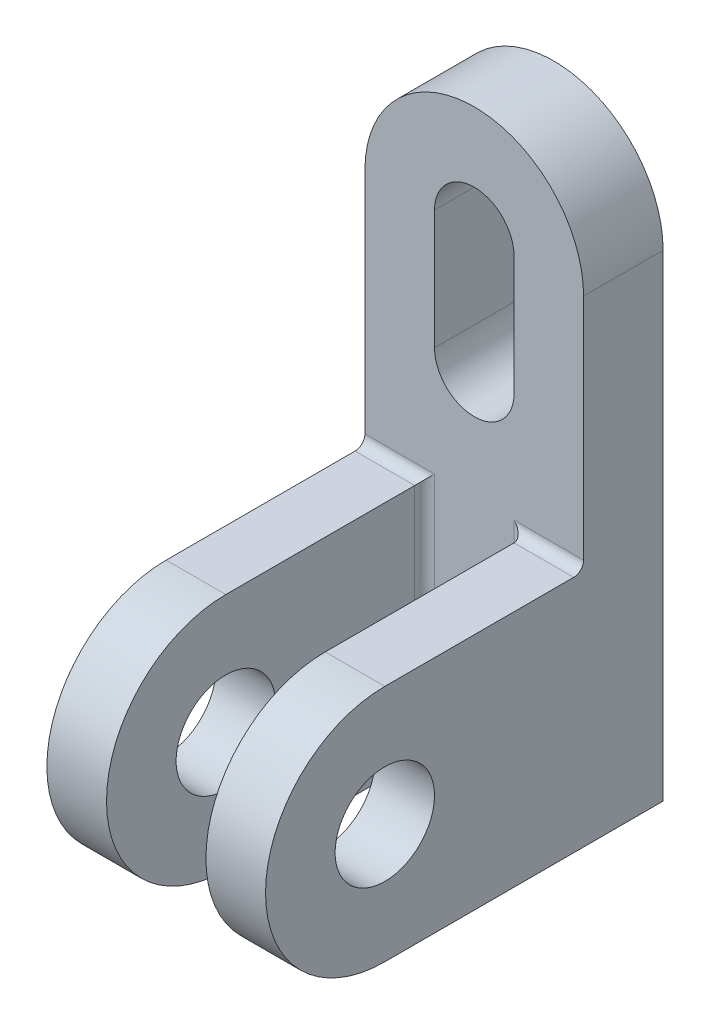
ISO-10303-21;
HEADER;
FILE_DESCRIPTION(('STEP AP214'),'2;1');
FILE_NAME('part.step','',(''),(''),'','','');
FILE_SCHEMA(('AUTOMOTIVE_DESIGN { 1 0 10303 214 1 1 1 1 }'));
ENDSEC;
DATA;
#1=APPLICATION_CONTEXT('core data for automotive mechanical design processes');
#2=APPLICATION_PROTOCOL_DEFINITION('international standard','automotive_design',2000,#1);
#3=PRODUCT_CONTEXT('',#1,'mechanical');
#4=PRODUCT('Part','Part','',(#3));
#5=PRODUCT_RELATED_PRODUCT_CATEGORY('part','',(#4));
#6=PRODUCT_DEFINITION_FORMATION('','',#4);
#7=PRODUCT_DEFINITION_CONTEXT('part definition',#1,'design');
#8=PRODUCT_DEFINITION('design','',#6,#7);
#9=PRODUCT_DEFINITION_SHAPE('','',#8);
#10=(LENGTH_UNIT() NAMED_UNIT(*) SI_UNIT(.MILLI.,.METRE.));
#11=(NAMED_UNIT(*) PLANE_ANGLE_UNIT() SI_UNIT($,.RADIAN.));
#12=(NAMED_UNIT(*) SI_UNIT($,.STERADIAN.) SOLID_ANGLE_UNIT());
#13=UNCERTAINTY_MEASURE_WITH_UNIT(LENGTH_MEASURE(1.E-05),#10,'distance_accuracy_value','');
#14=(GEOMETRIC_REPRESENTATION_CONTEXT(3) GLOBAL_UNCERTAINTY_ASSIGNED_CONTEXT((#13)) GLOBAL_UNIT_ASSIGNED_CONTEXT((#10,
#11,#12)) REPRESENTATION_CONTEXT('',''));
#15=CARTESIAN_POINT('',(0.,0.,0.));
#16=DIRECTION('',(0.,0.,1.));
#17=DIRECTION('',(1.,0.,0.));
#18=AXIS2_PLACEMENT_3D('',#15,#16,#17);
#19=CARTESIAN_POINT('',(0.,0.,16.));
#20=DIRECTION('',(0.,0.,1.));
#21=DIRECTION('',(1.,0.,0.));
#22=AXIS2_PLACEMENT_3D('',#19,#20,#21);
#23=PLANE('',#22);
#24=CARTESIAN_POINT('',(0.,37.,16.));
#25=DIRECTION('',(0.,0.,-1.));
#26=DIRECTION('',(-1.,0.,0.));
#27=AXIS2_PLACEMENT_3D('',#24,#25,#26);
#28=CIRCLE('',#27,8.);
#29=CARTESIAN_POINT('',(-8.,37.,16.));
#30=VERTEX_POINT('',#29);
#31=CARTESIAN_POINT('',(8.,37.,16.));
#32=VERTEX_POINT('',#31);
#33=EDGE_CURVE('E220',#30,#32,#28,.T.);
#34=ORIENTED_EDGE('',*,*,#33,.T.);
#35=DIRECTION('',(0.,-1.,0.));
#36=VECTOR('',#35,1.);
#37=CARTESIAN_POINT('',(8.,37.,16.));
#38=LINE('',#37,#36);
#39=CARTESIAN_POINT('',(8.,13.,16.));
#40=VERTEX_POINT('',#39);
#41=EDGE_CURVE('E223',#32,#40,#38,.T.);
#42=ORIENTED_EDGE('',*,*,#41,.T.);
#43=CARTESIAN_POINT('',(0.,13.,16.));
#44=DIRECTION('',(0.,0.,-1.));
#45=DIRECTION('',(-1.,0.,0.));
#46=AXIS2_PLACEMENT_3D('',#43,#44,#45);
#47=CIRCLE('',#46,8.);
#48=CARTESIAN_POINT('',(-8.,13.,16.));
#49=VERTEX_POINT('',#48);
#50=EDGE_CURVE('E227',#40,#49,#47,.T.);
#51=ORIENTED_EDGE('',*,*,#50,.T.);
#52=DIRECTION('',(0.,1.,0.));
#53=VECTOR('',#52,1.);
#54=CARTESIAN_POINT('',(-8.,37.,16.));
#55=LINE('',#54,#53);
#56=EDGE_CURVE('E230',#49,#30,#55,.T.);
#57=ORIENTED_EDGE('',*,*,#56,.T.);
#58=EDGE_LOOP('',(#34,#42,#51,#57));
#59=FACE_BOUND('',#58,.T.);
#60=DIRECTION('',(0.,1.,0.));
#61=VECTOR('',#60,1.);
#62=CARTESIAN_POINT('',(-22.,0.,16.));
#63=LINE('',#62,#61);
#64=CARTESIAN_POINT('',(-22.,-9.,16.));
#65=VERTEX_POINT('',#64);
#66=CARTESIAN_POINT('',(-22.,37.,16.));
#67=VERTEX_POINT('',#66);
#68=EDGE_CURVE('E258',#65,#67,#63,.T.);
#69=ORIENTED_EDGE('',*,*,#68,.F.);
#70=DIRECTION('',(-1.,0.,0.));
#71=VECTOR('',#70,1.);
#72=CARTESIAN_POINT('',(0.,-9.,16.));
#73=LINE('',#72,#71);
#74=CARTESIAN_POINT('',(-7.99999999999999,-9.,16.));
#75=VERTEX_POINT('',#74);
#76=EDGE_CURVE('E290',#65,#75,#73,.F.);
#77=ORIENTED_EDGE('',*,*,#76,.T.);
#78=DIRECTION('',(0.,-1.,0.));
#79=VECTOR('',#78,1.);
#80=CARTESIAN_POINT('',(-7.99999999999999,0.,16.));
#81=LINE('',#80,#79);
#82=CARTESIAN_POINT('',(-7.99999999999999,-59.,16.));
#83=VERTEX_POINT('',#82);
#84=EDGE_CURVE('E288',#75,#83,#81,.T.);
#85=ORIENTED_EDGE('',*,*,#84,.T.);
#86=DIRECTION('',(-1.,0.,0.));
#87=VECTOR('',#86,1.);
#88=CARTESIAN_POINT('',(0.,-59.,16.));
#89=LINE('',#88,#87);
#90=CARTESIAN_POINT('',(7.99999999999999,-59.,16.));
#91=VERTEX_POINT('',#90);
#92=EDGE_CURVE('E260',#91,#83,#89,.T.);
#93=ORIENTED_EDGE('',*,*,#92,.F.);
#94=DIRECTION('',(0.,-1.,0.));
#95=VECTOR('',#94,1.);
#96=CARTESIAN_POINT('',(7.99999999999999,0.,16.));
#97=LINE('',#96,#95);
#98=CARTESIAN_POINT('',(7.99999999999999,-9.,16.));
#99=VERTEX_POINT('',#98);
#100=EDGE_CURVE('E286',#91,#99,#97,.F.);
#101=ORIENTED_EDGE('',*,*,#100,.T.);
#102=DIRECTION('',(1.,0.,0.));
#103=VECTOR('',#102,1.);
#104=CARTESIAN_POINT('',(22.,-9.,16.));
#105=LINE('',#104,#103);
#106=CARTESIAN_POINT('',(22.,-9.,16.));
#107=VERTEX_POINT('',#106);
#108=EDGE_CURVE('E284',#99,#107,#105,.T.);
#109=ORIENTED_EDGE('',*,*,#108,.T.);
#110=DIRECTION('',(0.,1.,0.));
#111=VECTOR('',#110,1.);
#112=CARTESIAN_POINT('',(22.,0.,16.));
#113=LINE('',#112,#111);
#114=CARTESIAN_POINT('',(22.,37.,16.));
#115=VERTEX_POINT('',#114);
#116=EDGE_CURVE('E252',#107,#115,#113,.T.);
#117=ORIENTED_EDGE('',*,*,#116,.T.);
#118=CARTESIAN_POINT('',(0.,37.,16.));
#119=DIRECTION('',(0.,0.,1.));
#120=DIRECTION('',(1.,0.,0.));
#121=AXIS2_PLACEMENT_3D('',#118,#119,#120);
#122=CIRCLE('',#121,22.);
#123=EDGE_CURVE('E254',#115,#67,#122,.T.);
#124=ORIENTED_EDGE('',*,*,#123,.T.);
#125=EDGE_LOOP('',(#69,#77,#85,#93,#101,#109,#117,#124));
#126=FACE_BOUND('',#125,.T.);
#127=ADVANCED_FACE('F45',(#59,#126),#23,.T.);
#128=CARTESIAN_POINT('',(22.,0.,16.));
#129=DIRECTION('',(-1.,0.,0.));
#130=DIRECTION('',(0.,0.,1.));
#131=AXIS2_PLACEMENT_3D('',#128,#129,#130);
#132=PLANE('',#131);
#133=DIRECTION('',(0.,1.,0.));
#134=VECTOR('',#133,1.);
#135=CARTESIAN_POINT('',(22.,0.,0.));
#136=LINE('',#135,#134);
#137=CARTESIAN_POINT('',(22.,-59.,0.));
#138=VERTEX_POINT('',#137);
#139=CARTESIAN_POINT('',(22.,37.,0.));
#140=VERTEX_POINT('',#139);
#141=EDGE_CURVE('E245',#138,#140,#136,.T.);
#142=ORIENTED_EDGE('',*,*,#141,.T.);
#143=DIRECTION('',(0.,0.,-1.));
#144=VECTOR('',#143,1.);
#145=CARTESIAN_POINT('',(22.,37.,16.));
#146=LINE('',#145,#144);
#147=EDGE_CURVE('E278',#115,#140,#146,.T.);
#148=ORIENTED_EDGE('',*,*,#147,.F.);
#149=ORIENTED_EDGE('',*,*,#116,.F.);
#150=CARTESIAN_POINT('',(22.,-9.,18.));
#151=DIRECTION('',(-1.,0.,0.));
#152=DIRECTION('',(0.,0.,1.));
#153=AXIS2_PLACEMENT_3D('',#150,#151,#152);
#154=CIRCLE('',#153,2.);
#155=CARTESIAN_POINT('',(22.,-11.,18.));
#156=VERTEX_POINT('',#155);
#157=EDGE_CURVE('E11',#107,#156,#154,.T.);
#158=ORIENTED_EDGE('',*,*,#157,.T.);
#159=DIRECTION('',(0.,0.,1.));
#160=VECTOR('',#159,1.);
#161=CARTESIAN_POINT('',(22.,-11.,0.));
#162=LINE('',#161,#160);
#163=CARTESIAN_POINT('',(22.,-11.,56.));
#164=VERTEX_POINT('',#163);
#165=EDGE_CURVE('E210',#156,#164,#162,.T.);
#166=ORIENTED_EDGE('',*,*,#165,.T.);
#167=CARTESIAN_POINT('',(22.,-35.,56.));
#168=DIRECTION('',(1.,0.,0.));
#169=DIRECTION('',(0.,0.,-1.));
#170=AXIS2_PLACEMENT_3D('',#167,#168,#169);
#171=CIRCLE('',#170,24.);
#172=CARTESIAN_POINT('',(22.,-59.,56.));
#173=VERTEX_POINT('',#172);
#174=EDGE_CURVE('E200',#164,#173,#171,.T.);
#175=ORIENTED_EDGE('',*,*,#174,.T.);
#176=DIRECTION('',(0.,0.,-1.));
#177=VECTOR('',#176,1.);
#178=CARTESIAN_POINT('',(22.,-59.,16.));
#179=LINE('',#178,#177);
#180=EDGE_CURVE('E262',#173,#138,#179,.T.);
#181=ORIENTED_EDGE('',*,*,#180,.T.);
#182=EDGE_LOOP('',(#142,#148,#149,#158,#166,#175,#181));
#183=FACE_BOUND('',#182,.T.);
#184=CARTESIAN_POINT('',(22.,-35.,56.));
#185=DIRECTION('',(1.,0.,0.));
#186=DIRECTION('',(0.,0.,-1.));
#187=AXIS2_PLACEMENT_3D('',#184,#185,#186);
#188=CIRCLE('',#187,10.);
#189=CARTESIAN_POINT('',(22.,-35.,46.));
#190=VERTEX_POINT('',#189);
#191=EDGE_CURVE('E192',#190,#190,#188,.T.);
#192=ORIENTED_EDGE('',*,*,#191,.F.);
#193=EDGE_LOOP('',(#192));
#194=FACE_BOUND('',#193,.T.);
#195=ADVANCED_FACE('F322',(#183,#194),#132,.F.);
#196=CARTESIAN_POINT('',(0.,37.,16.));
#197=DIRECTION('',(0.,0.,-1.));
#198=DIRECTION('',(-1.,0.,0.));
#199=AXIS2_PLACEMENT_3D('',#196,#197,#198);
#200=CYLINDRICAL_SURFACE('',#199,22.);
#201=CARTESIAN_POINT('',(0.,37.,0.));
#202=DIRECTION('',(0.,0.,1.));
#203=DIRECTION('',(1.,0.,0.));
#204=AXIS2_PLACEMENT_3D('',#201,#202,#203);
#205=CIRCLE('',#204,22.);
#206=CARTESIAN_POINT('',(-22.,37.,0.));
#207=VERTEX_POINT('',#206);
#208=EDGE_CURVE('E265',#140,#207,#205,.T.);
#209=ORIENTED_EDGE('',*,*,#208,.T.);
#210=DIRECTION('',(0.,0.,-1.));
#211=VECTOR('',#210,1.);
#212=CARTESIAN_POINT('',(-22.,37.,16.));
#213=LINE('',#212,#211);
#214=EDGE_CURVE('E276',#67,#207,#213,.T.);
#215=ORIENTED_EDGE('',*,*,#214,.F.);
#216=ORIENTED_EDGE('',*,*,#123,.F.);
#217=ORIENTED_EDGE('',*,*,#147,.T.);
#218=EDGE_LOOP('',(#209,#215,#216,#217));
#219=FACE_BOUND('',#218,.T.);
#220=ADVANCED_FACE('F326',(#219),#200,.T.);
#221=CARTESIAN_POINT('',(-22.,0.,16.));
#222=DIRECTION('',(-1.,0.,0.));
#223=DIRECTION('',(0.,0.,1.));
#224=AXIS2_PLACEMENT_3D('',#221,#222,#223);
#225=PLANE('',#224);
#226=DIRECTION('',(0.,1.,0.));
#227=VECTOR('',#226,1.);
#228=CARTESIAN_POINT('',(-22.,0.,0.));
#229=LINE('',#228,#227);
#230=CARTESIAN_POINT('',(-22.,-59.,0.));
#231=VERTEX_POINT('',#230);
#232=EDGE_CURVE('E268',#231,#207,#229,.T.);
#233=ORIENTED_EDGE('',*,*,#232,.F.);
#234=DIRECTION('',(0.,0.,-1.));
#235=VECTOR('',#234,1.);
#236=CARTESIAN_POINT('',(-22.,-59.,16.));
#237=LINE('',#236,#235);
#238=CARTESIAN_POINT('',(-22.,-59.,56.));
#239=VERTEX_POINT('',#238);
#240=EDGE_CURVE('E274',#239,#231,#237,.T.);
#241=ORIENTED_EDGE('',*,*,#240,.F.);
#242=CARTESIAN_POINT('',(-22.,-35.,56.));
#243=DIRECTION('',(1.,0.,0.));
#244=DIRECTION('',(0.,0.,-1.));
#245=AXIS2_PLACEMENT_3D('',#242,#243,#244);
#246=CIRCLE('',#245,24.);
#247=CARTESIAN_POINT('',(-22.,-11.,56.));
#248=VERTEX_POINT('',#247);
#249=EDGE_CURVE('E189',#248,#239,#246,.T.);
#250=ORIENTED_EDGE('',*,*,#249,.F.);
#251=DIRECTION('',(0.,0.,1.));
#252=VECTOR('',#251,1.);
#253=CARTESIAN_POINT('',(-22.,-11.,0.));
#254=LINE('',#253,#252);
#255=CARTESIAN_POINT('',(-22.,-11.,18.));
#256=VERTEX_POINT('',#255);
#257=EDGE_CURVE('E309',#256,#248,#254,.T.);
#258=ORIENTED_EDGE('',*,*,#257,.F.);
#259=CARTESIAN_POINT('',(-22.,-9.,18.));
#260=DIRECTION('',(-1.,0.,0.));
#261=DIRECTION('',(0.,0.,1.));
#262=AXIS2_PLACEMENT_3D('',#259,#260,#261);
#263=CIRCLE('',#262,2.);
#264=EDGE_CURVE('E298',#256,#65,#263,.F.);
#265=ORIENTED_EDGE('',*,*,#264,.T.);
#266=ORIENTED_EDGE('',*,*,#68,.T.);
#267=ORIENTED_EDGE('',*,*,#214,.T.);
#268=EDGE_LOOP('',(#233,#241,#250,#258,#265,#266,#267));
#269=FACE_BOUND('',#268,.T.);
#270=CARTESIAN_POINT('',(-22.,-35.,56.));
#271=DIRECTION('',(1.,0.,0.));
#272=DIRECTION('',(0.,0.,-1.));
#273=AXIS2_PLACEMENT_3D('',#270,#271,#272);
#274=CIRCLE('',#273,10.);
#275=CARTESIAN_POINT('',(-22.,-35.,46.));
#276=VERTEX_POINT('',#275);
#277=EDGE_CURVE('E303',#276,#276,#274,.T.);
#278=ORIENTED_EDGE('',*,*,#277,.T.);
#279=EDGE_LOOP('',(#278));
#280=FACE_BOUND('',#279,.T.);
#281=ADVANCED_FACE('F335',(#269,#280),#225,.T.);
#282=CARTESIAN_POINT('',(0.,-59.,16.));
#283=DIRECTION('',(0.,-1.,0.));
#284=DIRECTION('',(0.,0.,-1.));
#285=AXIS2_PLACEMENT_3D('',#282,#283,#284);
#286=PLANE('',#285);
#287=DIRECTION('',(-1.,0.,0.));
#288=VECTOR('',#287,1.);
#289=CARTESIAN_POINT('',(0.,-59.,0.));
#290=LINE('',#289,#288);
#291=EDGE_CURVE('E255',#138,#231,#290,.T.);
#292=ORIENTED_EDGE('',*,*,#291,.F.);
#293=ORIENTED_EDGE('',*,*,#180,.F.);
#294=DIRECTION('',(1.,0.,0.));
#295=VECTOR('',#294,1.);
#296=CARTESIAN_POINT('',(9.99999999999999,-59.,56.));
#297=LINE('',#296,#295);
#298=CARTESIAN_POINT('',(9.99999999999999,-59.,56.));
#299=VERTEX_POINT('',#298);
#300=EDGE_CURVE('E214',#299,#173,#297,.T.);
#301=ORIENTED_EDGE('',*,*,#300,.F.);
#302=DIRECTION('',(0.,0.,1.));
#303=VECTOR('',#302,1.);
#304=CARTESIAN_POINT('',(9.99999999999999,-59.,0.));
#305=LINE('',#304,#303);
#306=CARTESIAN_POINT('',(9.99999999999999,-59.,18.));
#307=VERTEX_POINT('',#306);
#308=EDGE_CURVE('E205',#307,#299,#305,.T.);
#309=ORIENTED_EDGE('',*,*,#308,.F.);
#310=CARTESIAN_POINT('',(7.99999999999999,-59.,18.));
#311=DIRECTION('',(0.,-1.,0.));
#312=DIRECTION('',(0.,0.,-1.));
#313=AXIS2_PLACEMENT_3D('',#310,#311,#312);
#314=CIRCLE('',#313,2.);
#315=EDGE_CURVE('E54',#307,#91,#314,.F.);
#316=ORIENTED_EDGE('',*,*,#315,.T.);
#317=ORIENTED_EDGE('',*,*,#92,.T.);
#318=CARTESIAN_POINT('',(-7.99999999999999,-59.,18.));
#319=DIRECTION('',(0.,-1.,0.));
#320=DIRECTION('',(0.,0.,-1.));
#321=AXIS2_PLACEMENT_3D('',#318,#319,#320);
#322=CIRCLE('',#321,2.);
#323=CARTESIAN_POINT('',(-9.99999999999999,-59.,18.));
#324=VERTEX_POINT('',#323);
#325=EDGE_CURVE('E174',#83,#324,#322,.F.);
#326=ORIENTED_EDGE('',*,*,#325,.T.);
#327=DIRECTION('',(0.,0.,1.));
#328=VECTOR('',#327,1.);
#329=CARTESIAN_POINT('',(-9.99999999999999,-59.,0.));
#330=LINE('',#329,#328);
#331=CARTESIAN_POINT('',(-9.99999999999999,-59.,56.));
#332=VERTEX_POINT('',#331);
#333=EDGE_CURVE('E165',#324,#332,#330,.T.);
#334=ORIENTED_EDGE('',*,*,#333,.T.);
#335=DIRECTION('',(-1.,0.,0.));
#336=VECTOR('',#335,1.);
#337=CARTESIAN_POINT('',(-9.99999999999999,-59.,56.));
#338=LINE('',#337,#336);
#339=EDGE_CURVE('E170',#332,#239,#338,.T.);
#340=ORIENTED_EDGE('',*,*,#339,.T.);
#341=ORIENTED_EDGE('',*,*,#240,.T.);
#342=EDGE_LOOP('',(#292,#293,#301,#309,#316,#317,#326,#334,#340,#341));
#343=FACE_BOUND('',#342,.T.);
#344=ADVANCED_FACE('F168',(#343),#286,.T.);
#345=CARTESIAN_POINT('',(0.,0.,0.));
#346=DIRECTION('',(0.,0.,1.));
#347=DIRECTION('',(1.,0.,0.));
#348=AXIS2_PLACEMENT_3D('',#345,#346,#347);
#349=PLANE('',#348);
#350=DIRECTION('',(0.,-1.,0.));
#351=VECTOR('',#350,1.);
#352=CARTESIAN_POINT('',(8.,37.,0.));
#353=LINE('',#352,#351);
#354=CARTESIAN_POINT('',(8.,37.,0.));
#355=VERTEX_POINT('',#354);
#356=CARTESIAN_POINT('',(8.,13.,0.));
#357=VERTEX_POINT('',#356);
#358=EDGE_CURVE('E235',#355,#357,#353,.T.);
#359=ORIENTED_EDGE('',*,*,#358,.F.);
#360=CARTESIAN_POINT('',(0.,37.,0.));
#361=DIRECTION('',(0.,0.,-1.));
#362=DIRECTION('',(-1.,0.,0.));
#363=AXIS2_PLACEMENT_3D('',#360,#361,#362);
#364=CIRCLE('',#363,8.);
#365=CARTESIAN_POINT('',(-8.,37.,0.));
#366=VERTEX_POINT('',#365);
#367=EDGE_CURVE('E217',#366,#355,#364,.T.);
#368=ORIENTED_EDGE('',*,*,#367,.F.);
#369=DIRECTION('',(0.,1.,0.));
#370=VECTOR('',#369,1.);
#371=CARTESIAN_POINT('',(-8.,37.,0.));
#372=LINE('',#371,#370);
#373=CARTESIAN_POINT('',(-8.,13.,0.));
#374=VERTEX_POINT('',#373);
#375=EDGE_CURVE('E224',#374,#366,#372,.T.);
#376=ORIENTED_EDGE('',*,*,#375,.F.);
#377=CARTESIAN_POINT('',(0.,13.,0.));
#378=DIRECTION('',(0.,0.,-1.));
#379=DIRECTION('',(-1.,0.,0.));
#380=AXIS2_PLACEMENT_3D('',#377,#378,#379);
#381=CIRCLE('',#380,8.);
#382=EDGE_CURVE('E238',#357,#374,#381,.T.);
#383=ORIENTED_EDGE('',*,*,#382,.F.);
#384=EDGE_LOOP('',(#359,#368,#376,#383));
#385=FACE_BOUND('',#384,.T.);
#386=ORIENTED_EDGE('',*,*,#141,.F.);
#387=ORIENTED_EDGE('',*,*,#291,.T.);
#388=ORIENTED_EDGE('',*,*,#232,.T.);
#389=ORIENTED_EDGE('',*,*,#208,.F.);
#390=EDGE_LOOP('',(#386,#387,#388,#389));
#391=FACE_BOUND('',#390,.T.);
#392=ADVANCED_FACE('F371',(#385,#391),#349,.F.);
#393=CARTESIAN_POINT('',(0.,37.,16.));
#394=DIRECTION('',(0.,0.,-1.));
#395=DIRECTION('',(-1.,0.,0.));
#396=AXIS2_PLACEMENT_3D('',#393,#394,#395);
#397=CYLINDRICAL_SURFACE('',#396,8.);
#398=ORIENTED_EDGE('',*,*,#367,.T.);
#399=DIRECTION('',(0.,0.,-1.));
#400=VECTOR('',#399,1.);
#401=CARTESIAN_POINT('',(8.,37.,16.));
#402=LINE('',#401,#400);
#403=EDGE_CURVE('E233',#32,#355,#402,.T.);
#404=ORIENTED_EDGE('',*,*,#403,.F.);
#405=ORIENTED_EDGE('',*,*,#33,.F.);
#406=DIRECTION('',(0.,0.,-1.));
#407=VECTOR('',#406,1.);
#408=CARTESIAN_POINT('',(-8.,37.,16.));
#409=LINE('',#408,#407);
#410=EDGE_CURVE('E243',#30,#366,#409,.T.);
#411=ORIENTED_EDGE('',*,*,#410,.T.);
#412=EDGE_LOOP('',(#398,#404,#405,#411));
#413=FACE_BOUND('',#412,.T.);
#414=ADVANCED_FACE('F369',(#413),#397,.F.);
#415=CARTESIAN_POINT('',(-8.,37.,16.));
#416=DIRECTION('',(-1.,0.,0.));
#417=DIRECTION('',(0.,0.,1.));
#418=AXIS2_PLACEMENT_3D('',#415,#416,#417);
#419=PLANE('',#418);
#420=ORIENTED_EDGE('',*,*,#375,.T.);
#421=ORIENTED_EDGE('',*,*,#410,.F.);
#422=ORIENTED_EDGE('',*,*,#56,.F.);
#423=DIRECTION('',(0.,0.,-1.));
#424=VECTOR('',#423,1.);
#425=CARTESIAN_POINT('',(-8.,13.,16.));
#426=LINE('',#425,#424);
#427=EDGE_CURVE('E246',#49,#374,#426,.T.);
#428=ORIENTED_EDGE('',*,*,#427,.T.);
#429=EDGE_LOOP('',(#420,#421,#422,#428));
#430=FACE_BOUND('',#429,.T.);
#431=ADVANCED_FACE('F506',(#430),#419,.F.);
#432=CARTESIAN_POINT('',(0.,13.,16.));
#433=DIRECTION('',(0.,0.,-1.));
#434=DIRECTION('',(-1.,0.,0.));
#435=AXIS2_PLACEMENT_3D('',#432,#433,#434);
#436=CYLINDRICAL_SURFACE('',#435,8.);
#437=ORIENTED_EDGE('',*,*,#382,.T.);
#438=ORIENTED_EDGE('',*,*,#427,.F.);
#439=ORIENTED_EDGE('',*,*,#50,.F.);
#440=DIRECTION('',(0.,0.,-1.));
#441=VECTOR('',#440,1.);
#442=CARTESIAN_POINT('',(8.,13.,16.));
#443=LINE('',#442,#441);
#444=EDGE_CURVE('E248',#40,#357,#443,.T.);
#445=ORIENTED_EDGE('',*,*,#444,.T.);
#446=EDGE_LOOP('',(#437,#438,#439,#445));
#447=FACE_BOUND('',#446,.T.);
#448=ADVANCED_FACE('F497',(#447),#436,.F.);
#449=CARTESIAN_POINT('',(8.,37.,16.));
#450=DIRECTION('',(1.,0.,0.));
#451=DIRECTION('',(0.,0.,-1.));
#452=AXIS2_PLACEMENT_3D('',#449,#450,#451);
#453=PLANE('',#452);
#454=ORIENTED_EDGE('',*,*,#358,.T.);
#455=ORIENTED_EDGE('',*,*,#444,.F.);
#456=ORIENTED_EDGE('',*,*,#41,.F.);
#457=ORIENTED_EDGE('',*,*,#403,.T.);
#458=EDGE_LOOP('',(#454,#455,#456,#457));
#459=FACE_BOUND('',#458,.T.);
#460=ADVANCED_FACE('F487',(#459),#453,.F.);
#461=CARTESIAN_POINT('',(9.99999999999999,-11.,0.));
#462=DIRECTION('',(0.,1.,0.));
#463=DIRECTION('',(0.,0.,1.));
#464=AXIS2_PLACEMENT_3D('',#461,#462,#463);
#465=PLANE('',#464);
#466=ORIENTED_EDGE('',*,*,#165,.F.);
#467=DIRECTION('',(1.,0.,0.));
#468=VECTOR('',#467,1.);
#469=CARTESIAN_POINT('',(9.99999999999999,-11.,18.));
#470=LINE('',#469,#468);
#471=CARTESIAN_POINT('',(9.99999999999999,-11.,18.));
#472=VERTEX_POINT('',#471);
#473=EDGE_CURVE('E296',#156,#472,#470,.F.);
#474=ORIENTED_EDGE('',*,*,#473,.T.);
#475=DIRECTION('',(0.,0.,1.));
#476=VECTOR('',#475,1.);
#477=CARTESIAN_POINT('',(9.99999999999999,-11.,0.));
#478=LINE('',#477,#476);
#479=CARTESIAN_POINT('',(9.99999999999999,-11.,56.));
#480=VERTEX_POINT('',#479);
#481=EDGE_CURVE('E199',#472,#480,#478,.T.);
#482=ORIENTED_EDGE('',*,*,#481,.T.);
#483=DIRECTION('',(1.,0.,0.));
#484=VECTOR('',#483,1.);
#485=CARTESIAN_POINT('',(9.99999999999999,-11.,56.));
#486=LINE('',#485,#484);
#487=EDGE_CURVE('E207',#480,#164,#486,.T.);
#488=ORIENTED_EDGE('',*,*,#487,.T.);
#489=EDGE_LOOP('',(#466,#474,#482,#488));
#490=FACE_BOUND('',#489,.T.);
#491=ADVANCED_FACE('F478',(#490),#465,.T.);
#492=CARTESIAN_POINT('',(9.99999999999999,-35.,56.));
#493=DIRECTION('',(1.,0.,0.));
#494=DIRECTION('',(0.,0.,-1.));
#495=AXIS2_PLACEMENT_3D('',#492,#493,#494);
#496=CYLINDRICAL_SURFACE('',#495,10.);
#497=CARTESIAN_POINT('',(9.99999999999999,-35.,56.));
#498=DIRECTION('',(1.,0.,0.));
#499=DIRECTION('',(0.,0.,-1.));
#500=AXIS2_PLACEMENT_3D('',#497,#498,#499);
#501=CIRCLE('',#500,10.);
#502=CARTESIAN_POINT('',(9.99999999999999,-35.,46.));
#503=VERTEX_POINT('',#502);
#504=EDGE_CURVE('E196',#503,#503,#501,.T.);
#505=ORIENTED_EDGE('',*,*,#504,.F.);
#506=EDGE_LOOP('',(#505));
#507=FACE_BOUND('',#506,.T.);
#508=ORIENTED_EDGE('',*,*,#191,.T.);
#509=EDGE_LOOP('',(#508));
#510=FACE_BOUND('',#509,.T.);
#511=ADVANCED_FACE('F469',(#507,#510),#496,.F.);
#512=CARTESIAN_POINT('',(9.99999999999999,-35.,56.));
#513=DIRECTION('',(1.,0.,0.));
#514=DIRECTION('',(0.,0.,-1.));
#515=AXIS2_PLACEMENT_3D('',#512,#513,#514);
#516=CYLINDRICAL_SURFACE('',#515,24.);
#517=ORIENTED_EDGE('',*,*,#174,.F.);
#518=ORIENTED_EDGE('',*,*,#487,.F.);
#519=CARTESIAN_POINT('',(9.99999999999999,-35.,56.));
#520=DIRECTION('',(1.,0.,0.));
#521=DIRECTION('',(0.,0.,-1.));
#522=AXIS2_PLACEMENT_3D('',#519,#520,#521);
#523=CIRCLE('',#522,24.);
#524=EDGE_CURVE('E202',#480,#299,#523,.T.);
#525=ORIENTED_EDGE('',*,*,#524,.T.);
#526=ORIENTED_EDGE('',*,*,#300,.T.);
#527=EDGE_LOOP('',(#517,#518,#525,#526));
#528=FACE_BOUND('',#527,.T.);
#529=ADVANCED_FACE('F459',(#528),#516,.T.);
#530=CARTESIAN_POINT('',(9.99999999999999,0.,0.));
#531=DIRECTION('',(1.,0.,0.));
#532=DIRECTION('',(0.,0.,-1.));
#533=AXIS2_PLACEMENT_3D('',#530,#531,#532);
#534=PLANE('',#533);
#535=ORIENTED_EDGE('',*,*,#504,.T.);
#536=EDGE_LOOP('',(#535));
#537=FACE_BOUND('',#536,.T.);
#538=ORIENTED_EDGE('',*,*,#481,.F.);
#539=DIRECTION('',(0.,-1.,0.));
#540=VECTOR('',#539,1.);
#541=CARTESIAN_POINT('',(9.99999999999999,0.,18.));
#542=LINE('',#541,#540);
#543=EDGE_CURVE('E294',#472,#307,#542,.T.);
#544=ORIENTED_EDGE('',*,*,#543,.T.);
#545=ORIENTED_EDGE('',*,*,#308,.T.);
#546=ORIENTED_EDGE('',*,*,#524,.F.);
#547=EDGE_LOOP('',(#538,#544,#545,#546));
#548=FACE_BOUND('',#547,.T.);
#549=ADVANCED_FACE('F443',(#537,#548),#534,.F.);
#550=CARTESIAN_POINT('',(-9.99999999999999,-11.,0.));
#551=DIRECTION('',(0.,-1.,0.));
#552=DIRECTION('',(0.,0.,-1.));
#553=AXIS2_PLACEMENT_3D('',#550,#551,#552);
#554=PLANE('',#553);
#555=DIRECTION('',(0.,0.,1.));
#556=VECTOR('',#555,1.);
#557=CARTESIAN_POINT('',(-9.99999999999999,-11.,0.));
#558=LINE('',#557,#556);
#559=CARTESIAN_POINT('',(-9.99999999999999,-11.,18.));
#560=VERTEX_POINT('',#559);
#561=CARTESIAN_POINT('',(-9.99999999999999,-11.,56.));
#562=VERTEX_POINT('',#561);
#563=EDGE_CURVE('E178',#560,#562,#558,.T.);
#564=ORIENTED_EDGE('',*,*,#563,.F.);
#565=DIRECTION('',(-1.,0.,0.));
#566=VECTOR('',#565,1.);
#567=CARTESIAN_POINT('',(-9.99999999999999,-11.,18.));
#568=LINE('',#567,#566);
#569=EDGE_CURVE('E281',#560,#256,#568,.T.);
#570=ORIENTED_EDGE('',*,*,#569,.T.);
#571=ORIENTED_EDGE('',*,*,#257,.T.);
#572=DIRECTION('',(-1.,0.,0.));
#573=VECTOR('',#572,1.);
#574=CARTESIAN_POINT('',(-9.99999999999999,-11.,56.));
#575=LINE('',#574,#573);
#576=EDGE_CURVE('E190',#562,#248,#575,.T.);
#577=ORIENTED_EDGE('',*,*,#576,.F.);
#578=EDGE_LOOP('',(#564,#570,#571,#577));
#579=FACE_BOUND('',#578,.T.);
#580=ADVANCED_FACE('F333',(#579),#554,.F.);
#581=CARTESIAN_POINT('',(-9.99999999999999,-35.,56.));
#582=DIRECTION('',(-1.,0.,0.));
#583=DIRECTION('',(0.,0.,1.));
#584=AXIS2_PLACEMENT_3D('',#581,#582,#583);
#585=CYLINDRICAL_SURFACE('',#584,24.);
#586=ORIENTED_EDGE('',*,*,#249,.T.);
#587=ORIENTED_EDGE('',*,*,#339,.F.);
#588=CARTESIAN_POINT('',(-9.99999999999999,-35.,56.));
#589=DIRECTION('',(1.,0.,0.));
#590=DIRECTION('',(0.,0.,-1.));
#591=AXIS2_PLACEMENT_3D('',#588,#589,#590);
#592=CIRCLE('',#591,24.);
#593=EDGE_CURVE('E177',#562,#332,#592,.T.);
#594=ORIENTED_EDGE('',*,*,#593,.F.);
#595=ORIENTED_EDGE('',*,*,#576,.T.);
#596=EDGE_LOOP('',(#586,#587,#594,#595));
#597=FACE_BOUND('',#596,.T.);
#598=ADVANCED_FACE('F187',(#597),#585,.T.);
#599=CARTESIAN_POINT('',(-9.99999999999999,-35.,56.));
#600=DIRECTION('',(-1.,0.,0.));
#601=DIRECTION('',(0.,0.,1.));
#602=AXIS2_PLACEMENT_3D('',#599,#600,#601);
#603=CYLINDRICAL_SURFACE('',#602,10.);
#604=CARTESIAN_POINT('',(-9.99999999999999,-35.,56.));
#605=DIRECTION('',(1.,0.,0.));
#606=DIRECTION('',(0.,0.,-1.));
#607=AXIS2_PLACEMENT_3D('',#604,#605,#606);
#608=CIRCLE('',#607,10.);
#609=CARTESIAN_POINT('',(-9.99999999999999,-35.,46.));
#610=VERTEX_POINT('',#609);
#611=EDGE_CURVE('E338',#610,#610,#608,.T.);
#612=ORIENTED_EDGE('',*,*,#611,.T.);
#613=EDGE_LOOP('',(#612));
#614=FACE_BOUND('',#613,.T.);
#615=ORIENTED_EDGE('',*,*,#277,.F.);
#616=EDGE_LOOP('',(#615));
#617=FACE_BOUND('',#616,.T.);
#618=ADVANCED_FACE('F344',(#614,#617),#603,.F.);
#619=CARTESIAN_POINT('',(-9.99999999999999,0.,0.));
#620=DIRECTION('',(-1.,0.,0.));
#621=DIRECTION('',(0.,0.,-1.));
#622=AXIS2_PLACEMENT_3D('',#619,#620,#621);
#623=PLANE('',#622);
#624=ORIENTED_EDGE('',*,*,#611,.F.);
#625=EDGE_LOOP('',(#624));
#626=FACE_BOUND('',#625,.T.);
#627=ORIENTED_EDGE('',*,*,#333,.F.);
#628=DIRECTION('',(0.,-1.,0.));
#629=VECTOR('',#628,1.);
#630=CARTESIAN_POINT('',(-9.99999999999999,0.,18.));
#631=LINE('',#630,#629);
#632=EDGE_CURVE('E292',#324,#560,#631,.F.);
#633=ORIENTED_EDGE('',*,*,#632,.T.);
#634=ORIENTED_EDGE('',*,*,#563,.T.);
#635=ORIENTED_EDGE('',*,*,#593,.T.);
#636=EDGE_LOOP('',(#627,#633,#634,#635));
#637=FACE_BOUND('',#636,.T.);
#638=ADVANCED_FACE('F181',(#626,#637),#623,.F.);
#639=CARTESIAN_POINT('',(-7.99999999999999,0.,18.));
#640=DIRECTION('',(0.,-1.,0.));
#641=DIRECTION('',(0.,0.,-1.));
#642=AXIS2_PLACEMENT_3D('',#639,#640,#641);
#643=CYLINDRICAL_SURFACE('',#642,2.);
#644=ORIENTED_EDGE('',*,*,#325,.F.);
#645=ORIENTED_EDGE('',*,*,#84,.F.);
#646=CARTESIAN_POINT('',(-7.99999999999999,-9.,18.));
#647=DIRECTION('',(0.707106781186547,-0.707106781186547,0.));
#648=DIRECTION('',(-0.707106781186547,-0.707106781186547,0.));
#649=AXIS2_PLACEMENT_3D('',#646,#647,#648);
#650=ELLIPSE('',#649,2.82842712474619,2.);
#651=EDGE_CURVE('E301',#560,#75,#650,.T.);
#652=ORIENTED_EDGE('',*,*,#651,.F.);
#653=ORIENTED_EDGE('',*,*,#632,.F.);
#654=EDGE_LOOP('',(#644,#645,#652,#653));
#655=FACE_BOUND('',#654,.T.);
#656=ADVANCED_FACE('F348',(#655),#643,.F.);
#657=CARTESIAN_POINT('',(-9.99999999999999,-9.,18.));
#658=DIRECTION('',(-1.,0.,0.));
#659=DIRECTION('',(0.,0.,1.));
#660=AXIS2_PLACEMENT_3D('',#657,#658,#659);
#661=CYLINDRICAL_SURFACE('',#660,2.);
#662=ORIENTED_EDGE('',*,*,#651,.T.);
#663=ORIENTED_EDGE('',*,*,#76,.F.);
#664=ORIENTED_EDGE('',*,*,#264,.F.);
#665=ORIENTED_EDGE('',*,*,#569,.F.);
#666=EDGE_LOOP('',(#662,#663,#664,#665));
#667=FACE_BOUND('',#666,.T.);
#668=ADVANCED_FACE('F330',(#667),#661,.F.);
#669=CARTESIAN_POINT('',(0.,-9.,18.));
#670=DIRECTION('',(-1.,0.,0.));
#671=DIRECTION('',(0.,0.,1.));
#672=AXIS2_PLACEMENT_3D('',#669,#670,#671);
#673=CYLINDRICAL_SURFACE('',#672,2.);
#674=ORIENTED_EDGE('',*,*,#157,.F.);
#675=ORIENTED_EDGE('',*,*,#108,.F.);
#676=CARTESIAN_POINT('',(7.99999999999999,-9.,18.));
#677=DIRECTION('',(-0.707106781186547,-0.707106781186547,0.));
#678=DIRECTION('',(-0.707106781186547,0.707106781186547,0.));
#679=AXIS2_PLACEMENT_3D('',#676,#677,#678);
#680=ELLIPSE('',#679,2.82842712474619,2.);
#681=EDGE_CURVE('E49',#472,#99,#680,.F.);
#682=ORIENTED_EDGE('',*,*,#681,.F.);
#683=ORIENTED_EDGE('',*,*,#473,.F.);
#684=EDGE_LOOP('',(#674,#675,#682,#683));
#685=FACE_BOUND('',#684,.T.);
#686=ADVANCED_FACE('F47',(#685),#673,.F.);
#687=CARTESIAN_POINT('',(7.99999999999999,0.,18.));
#688=DIRECTION('',(0.,-1.,0.));
#689=DIRECTION('',(0.,0.,-1.));
#690=AXIS2_PLACEMENT_3D('',#687,#688,#689);
#691=CYLINDRICAL_SURFACE('',#690,2.);
#692=ORIENTED_EDGE('',*,*,#681,.T.);
#693=ORIENTED_EDGE('',*,*,#100,.F.);
#694=ORIENTED_EDGE('',*,*,#315,.F.);
#695=ORIENTED_EDGE('',*,*,#543,.F.);
#696=EDGE_LOOP('',(#692,#693,#694,#695));
#697=FACE_BOUND('',#696,.T.);
#698=ADVANCED_FACE('F313',(#697),#691,.F.);
#699=CLOSED_SHELL('',(#127,#195,#220,#281,#344,#392,#414,#431,#448,#460,#491,#511,#529,#549,
#580,#598,#618,#638,#656,#668,#686,#698));
#700=MANIFOLD_SOLID_BREP('B2',#699);
#701=ADVANCED_BREP_SHAPE_REPRESENTATION('',(#18,#700),#14);
#702=SHAPE_DEFINITION_REPRESENTATION(#9,#701);
ENDSEC;
END-ISO-10303-21;
